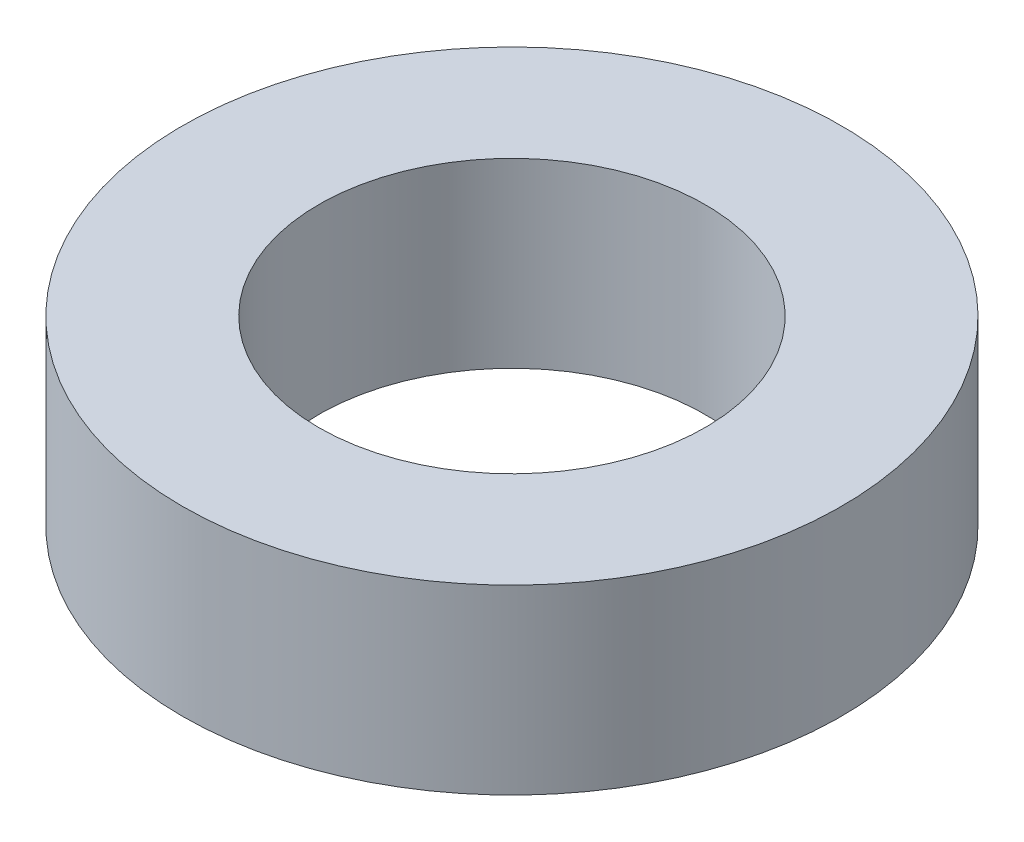
ISO-10303-21;
HEADER;
FILE_DESCRIPTION(('STEP AP214'),'2;1');
FILE_NAME('part.step','',(''),(''),'','','');
FILE_SCHEMA(('AUTOMOTIVE_DESIGN { 1 0 10303 214 1 1 1 1 }'));
ENDSEC;
DATA;
#1=APPLICATION_CONTEXT('core data for automotive mechanical design processes');
#2=APPLICATION_PROTOCOL_DEFINITION('international standard','automotive_design',2000,#1);
#3=PRODUCT_CONTEXT('',#1,'mechanical');
#4=PRODUCT('Part','Part','',(#3));
#5=PRODUCT_RELATED_PRODUCT_CATEGORY('part','',(#4));
#6=PRODUCT_DEFINITION_FORMATION('','',#4);
#7=PRODUCT_DEFINITION_CONTEXT('part definition',#1,'design');
#8=PRODUCT_DEFINITION('design','',#6,#7);
#9=PRODUCT_DEFINITION_SHAPE('','',#8);
#10=(LENGTH_UNIT() NAMED_UNIT(*) SI_UNIT(.MILLI.,.METRE.));
#11=(NAMED_UNIT(*) PLANE_ANGLE_UNIT() SI_UNIT($,.RADIAN.));
#12=(NAMED_UNIT(*) SI_UNIT($,.STERADIAN.) SOLID_ANGLE_UNIT());
#13=UNCERTAINTY_MEASURE_WITH_UNIT(LENGTH_MEASURE(1.E-05),#10,'distance_accuracy_value','');
#14=(GEOMETRIC_REPRESENTATION_CONTEXT(3) GLOBAL_UNCERTAINTY_ASSIGNED_CONTEXT((#13)) GLOBAL_UNIT_ASSIGNED_CONTEXT((#10,
#11,#12)) REPRESENTATION_CONTEXT('',''));
#15=CARTESIAN_POINT('',(0.,0.,0.));
#16=DIRECTION('',(0.,0.,1.));
#17=DIRECTION('',(1.,0.,0.));
#18=AXIS2_PLACEMENT_3D('',#15,#16,#17);
#19=CARTESIAN_POINT('',(0.,4.,0.));
#20=DIRECTION('',(0.,1.,0.));
#21=DIRECTION('',(0.,0.,1.));
#22=AXIS2_PLACEMENT_3D('',#19,#20,#21);
#23=PLANE('',#22);
#24=CARTESIAN_POINT('',(0.,4.,0.));
#25=DIRECTION('',(0.,1.,0.));
#26=DIRECTION('',(0.,0.,1.));
#27=AXIS2_PLACEMENT_3D('',#24,#25,#26);
#28=CIRCLE('',#27,7.25);
#29=CARTESIAN_POINT('',(0.,4.,7.25));
#30=VERTEX_POINT('',#29);
#31=EDGE_CURVE('E10',#30,#30,#28,.T.);
#32=ORIENTED_EDGE('',*,*,#31,.T.);
#33=EDGE_LOOP('',(#32));
#34=FACE_BOUND('',#33,.T.);
#35=CARTESIAN_POINT('',(0.,4.,0.));
#36=DIRECTION('',(0.,1.,0.));
#37=DIRECTION('',(0.,0.,1.));
#38=AXIS2_PLACEMENT_3D('',#35,#36,#37);
#39=CIRCLE('',#38,4.25);
#40=CARTESIAN_POINT('',(0.,4.,4.25));
#41=VERTEX_POINT('',#40);
#42=EDGE_CURVE('E42',#41,#41,#39,.T.);
#43=ORIENTED_EDGE('',*,*,#42,.F.);
#44=EDGE_LOOP('',(#43));
#45=FACE_BOUND('',#44,.T.);
#46=ADVANCED_FACE('F31',(#34,#45),#23,.T.);
#47=CARTESIAN_POINT('',(0.,0.,0.));
#48=DIRECTION('',(0.,1.,0.));
#49=DIRECTION('',(0.,0.,1.));
#50=AXIS2_PLACEMENT_3D('',#47,#48,#49);
#51=PLANE('',#50);
#52=CARTESIAN_POINT('',(0.,0.,0.));
#53=DIRECTION('',(0.,1.,0.));
#54=DIRECTION('',(0.,0.,1.));
#55=AXIS2_PLACEMENT_3D('',#52,#53,#54);
#56=CIRCLE('',#55,7.25);
#57=CARTESIAN_POINT('',(0.,0.,7.25));
#58=VERTEX_POINT('',#57);
#59=EDGE_CURVE('E35',#58,#58,#56,.T.);
#60=ORIENTED_EDGE('',*,*,#59,.F.);
#61=EDGE_LOOP('',(#60));
#62=FACE_BOUND('',#61,.T.);
#63=CARTESIAN_POINT('',(0.,0.,0.));
#64=DIRECTION('',(0.,1.,0.));
#65=DIRECTION('',(0.,0.,1.));
#66=AXIS2_PLACEMENT_3D('',#63,#64,#65);
#67=CIRCLE('',#66,4.25);
#68=CARTESIAN_POINT('',(0.,0.,4.25));
#69=VERTEX_POINT('',#68);
#70=EDGE_CURVE('E44',#69,#69,#67,.T.);
#71=ORIENTED_EDGE('',*,*,#70,.T.);
#72=EDGE_LOOP('',(#71));
#73=FACE_BOUND('',#72,.T.);
#74=ADVANCED_FACE('F54',(#62,#73),#51,.F.);
#75=CARTESIAN_POINT('',(0.,4.,0.));
#76=DIRECTION('',(0.,-1.,0.));
#77=DIRECTION('',(0.,0.,-1.));
#78=AXIS2_PLACEMENT_3D('',#75,#76,#77);
#79=CYLINDRICAL_SURFACE('',#78,7.25);
#80=ORIENTED_EDGE('',*,*,#31,.F.);
#81=EDGE_LOOP('',(#80));
#82=FACE_BOUND('',#81,.T.);
#83=ORIENTED_EDGE('',*,*,#59,.T.);
#84=EDGE_LOOP('',(#83));
#85=FACE_BOUND('',#84,.T.);
#86=ADVANCED_FACE('F33',(#82,#85),#79,.T.);
#87=CARTESIAN_POINT('',(0.,4.,0.));
#88=DIRECTION('',(0.,-1.,0.));
#89=DIRECTION('',(0.,0.,-1.));
#90=AXIS2_PLACEMENT_3D('',#87,#88,#89);
#91=CYLINDRICAL_SURFACE('',#90,4.25);
#92=ORIENTED_EDGE('',*,*,#42,.T.);
#93=EDGE_LOOP('',(#92));
#94=FACE_BOUND('',#93,.T.);
#95=ORIENTED_EDGE('',*,*,#70,.F.);
#96=EDGE_LOOP('',(#95));
#97=FACE_BOUND('',#96,.T.);
#98=ADVANCED_FACE('F50',(#94,#97),#91,.F.);
#99=CLOSED_SHELL('',(#46,#74,#86,#98));
#100=MANIFOLD_SOLID_BREP('B2',#99);
#101=ADVANCED_BREP_SHAPE_REPRESENTATION('',(#18,#100),#14);
#102=SHAPE_DEFINITION_REPRESENTATION(#9,#101);
ENDSEC;
END-ISO-10303-21;
